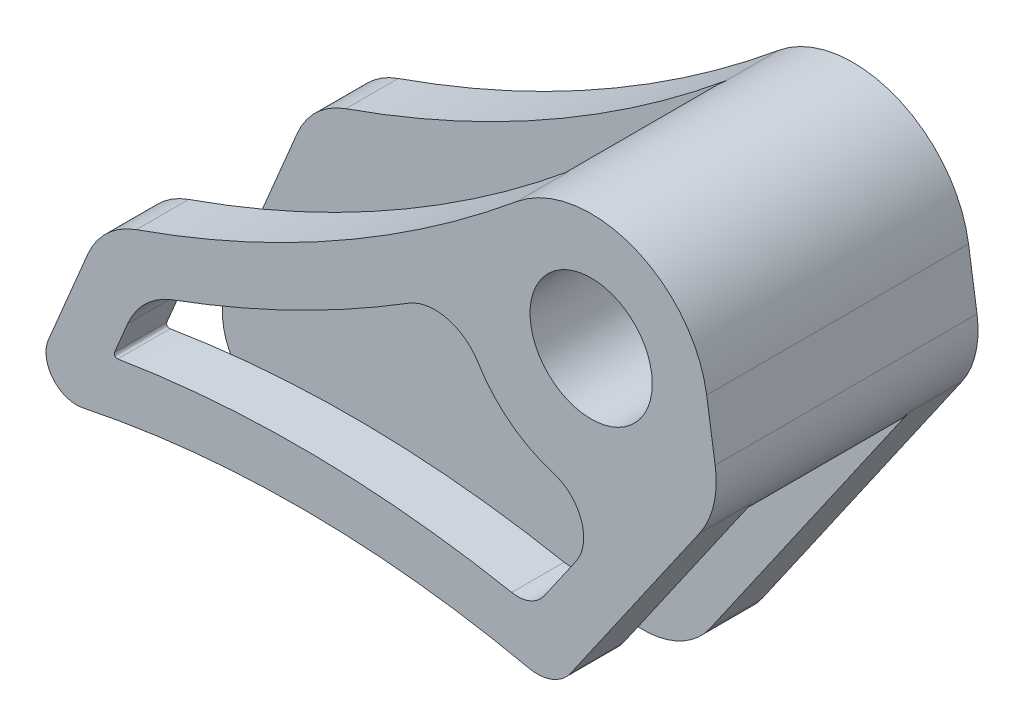
ISO-10303-21;
HEADER;
FILE_DESCRIPTION(('STEP AP214'),'2;1');
FILE_NAME('part.step','',(''),(''),'','','');
FILE_SCHEMA(('AUTOMOTIVE_DESIGN { 1 0 10303 214 1 1 1 1 }'));
ENDSEC;
DATA;
#1=APPLICATION_CONTEXT('core data for automotive mechanical design processes');
#2=APPLICATION_PROTOCOL_DEFINITION('international standard','automotive_design',2000,#1);
#3=PRODUCT_CONTEXT('',#1,'mechanical');
#4=PRODUCT('Part','Part','',(#3));
#5=PRODUCT_RELATED_PRODUCT_CATEGORY('part','',(#4));
#6=PRODUCT_DEFINITION_FORMATION('','',#4);
#7=PRODUCT_DEFINITION_CONTEXT('part definition',#1,'design');
#8=PRODUCT_DEFINITION('design','',#6,#7);
#9=PRODUCT_DEFINITION_SHAPE('','',#8);
#10=(LENGTH_UNIT() NAMED_UNIT(*) SI_UNIT(.MILLI.,.METRE.));
#11=(NAMED_UNIT(*) PLANE_ANGLE_UNIT() SI_UNIT($,.RADIAN.));
#12=(NAMED_UNIT(*) SI_UNIT($,.STERADIAN.) SOLID_ANGLE_UNIT());
#13=UNCERTAINTY_MEASURE_WITH_UNIT(LENGTH_MEASURE(1.E-05),#10,'distance_accuracy_value','');
#14=(GEOMETRIC_REPRESENTATION_CONTEXT(3) GLOBAL_UNCERTAINTY_ASSIGNED_CONTEXT((#13)) GLOBAL_UNIT_ASSIGNED_CONTEXT((#10,
#11,#12)) REPRESENTATION_CONTEXT('',''));
#15=CARTESIAN_POINT('',(0.,0.,0.));
#16=DIRECTION('',(0.,0.,1.));
#17=DIRECTION('',(1.,0.,0.));
#18=AXIS2_PLACEMENT_3D('',#15,#16,#17);
#19=CARTESIAN_POINT('',(-12.5649946800251,56.468477358393,15.));
#20=DIRECTION('',(0.,0.,-1.));
#21=DIRECTION('',(-1.,0.,0.));
#22=AXIS2_PLACEMENT_3D('',#19,#20,#21);
#23=CYLINDRICAL_SURFACE('',#22,3.90008535636228);
#24=CARTESIAN_POINT('',(-12.5649946800251,56.468477358393,3.));
#25=DIRECTION('',(0.,0.,1.));
#26=DIRECTION('',(1.,0.,0.));
#27=AXIS2_PLACEMENT_3D('',#24,#25,#26);
#28=CIRCLE('',#27,3.90008535636228);
#29=CARTESIAN_POINT('',(-16.1614135363366,57.977264022199,3.));
#30=VERTEX_POINT('',#29);
#31=CARTESIAN_POINT('',(-11.865953559232,52.6315505545105,3.));
#32=VERTEX_POINT('',#31);
#33=EDGE_CURVE('E350',#30,#32,#28,.T.);
#34=ORIENTED_EDGE('',*,*,#33,.F.);
#35=DIRECTION('',(0.,0.,-1.));
#36=VECTOR('',#35,1.);
#37=CARTESIAN_POINT('',(-16.1614135363366,57.977264022199,15.));
#38=LINE('',#37,#36);
#39=CARTESIAN_POINT('',(-16.1614135363366,57.977264022199,0.));
#40=VERTEX_POINT('',#39);
#41=EDGE_CURVE('E385',#30,#40,#38,.T.);
#42=ORIENTED_EDGE('',*,*,#41,.T.);
#43=CARTESIAN_POINT('',(-12.5649946800251,56.468477358393,0.));
#44=DIRECTION('',(0.,0.,1.));
#45=DIRECTION('',(1.,0.,0.));
#46=AXIS2_PLACEMENT_3D('',#43,#44,#45);
#47=CIRCLE('',#46,3.90008535636228);
#48=CARTESIAN_POINT('',(-11.865953559232,52.6315505545106,0.));
#49=VERTEX_POINT('',#48);
#50=EDGE_CURVE('E368',#40,#49,#47,.T.);
#51=ORIENTED_EDGE('',*,*,#50,.T.);
#52=DIRECTION('',(0.,0.,-1.));
#53=VECTOR('',#52,1.);
#54=CARTESIAN_POINT('',(-11.865953559232,52.6315505545106,15.));
#55=LINE('',#54,#53);
#56=EDGE_CURVE('E439',#32,#49,#55,.T.);
#57=ORIENTED_EDGE('',*,*,#56,.F.);
#58=EDGE_LOOP('',(#34,#42,#51,#57));
#59=FACE_BOUND('',#58,.T.);
#60=ADVANCED_FACE('F37',(#59),#23,.T.);
#61=CARTESIAN_POINT('',(-1.96419316827227,-1.71765540720911,15.));
#62=DIRECTION('',(0.,0.,-1.));
#63=DIRECTION('',(-1.,0.,0.));
#64=AXIS2_PLACEMENT_3D('',#61,#62,#63);
#65=CYLINDRICAL_SURFACE('',#64,55.2438326649175);
#66=CARTESIAN_POINT('',(-1.96419316827227,-1.71765540720911,3.));
#67=DIRECTION('',(0.,0.,1.));
#68=DIRECTION('',(1.,0.,0.));
#69=AXIS2_PLACEMENT_3D('',#66,#67,#68);
#70=CIRCLE('',#69,55.2438326649175);
#71=CARTESIAN_POINT('',(6.9008090395985,52.8102528908711,3.));
#72=VERTEX_POINT('',#71);
#73=EDGE_CURVE('E352',#32,#72,#70,.F.);
#74=ORIENTED_EDGE('',*,*,#73,.F.);
#75=ORIENTED_EDGE('',*,*,#56,.T.);
#76=CARTESIAN_POINT('',(-1.96419316827227,-1.71765540720911,0.));
#77=DIRECTION('',(0.,0.,-1.));
#78=DIRECTION('',(-1.,0.,0.));
#79=AXIS2_PLACEMENT_3D('',#76,#77,#78);
#80=CIRCLE('',#79,55.2438326649175);
#81=CARTESIAN_POINT('',(6.9008090395985,52.8102528908711,0.));
#82=VERTEX_POINT('',#81);
#83=EDGE_CURVE('E388',#49,#82,#80,.T.);
#84=ORIENTED_EDGE('',*,*,#83,.T.);
#85=DIRECTION('',(0.,0.,-1.));
#86=VECTOR('',#85,1.);
#87=CARTESIAN_POINT('',(6.9008090395985,52.8102528908711,15.));
#88=LINE('',#87,#86);
#89=EDGE_CURVE('E437',#72,#82,#88,.T.);
#90=ORIENTED_EDGE('',*,*,#89,.F.);
#91=EDGE_LOOP('',(#74,#75,#84,#90));
#92=FACE_BOUND('',#91,.T.);
#93=ADVANCED_FACE('F510',(#92),#65,.F.);
#94=CARTESIAN_POINT('',(7.64846138166184,57.4090017000569,15.));
#95=DIRECTION('',(0.,0.,-1.));
#96=DIRECTION('',(-1.,0.,0.));
#97=AXIS2_PLACEMENT_3D('',#94,#95,#96);
#98=CYLINDRICAL_SURFACE('',#97,4.65912809810806);
#99=CARTESIAN_POINT('',(7.64846138166184,57.4090017000569,3.));
#100=DIRECTION('',(0.,0.,1.));
#101=DIRECTION('',(1.,0.,0.));
#102=AXIS2_PLACEMENT_3D('',#99,#100,#101);
#103=CIRCLE('',#102,4.65912809810806);
#104=CARTESIAN_POINT('',(11.4756081363501,54.7518561728682,3.));
#105=VERTEX_POINT('',#104);
#106=EDGE_CURVE('E354',#72,#105,#103,.T.);
#107=ORIENTED_EDGE('',*,*,#106,.F.);
#108=ORIENTED_EDGE('',*,*,#89,.T.);
#109=CARTESIAN_POINT('',(7.64846138166184,57.4090017000569,0.));
#110=DIRECTION('',(0.,0.,1.));
#111=DIRECTION('',(1.,0.,0.));
#112=AXIS2_PLACEMENT_3D('',#109,#110,#111);
#113=CIRCLE('',#112,4.65912809810806);
#114=CARTESIAN_POINT('',(11.4756081363501,54.7518561728682,0.));
#115=VERTEX_POINT('',#114);
#116=EDGE_CURVE('E391',#82,#115,#113,.T.);
#117=ORIENTED_EDGE('',*,*,#116,.T.);
#118=DIRECTION('',(0.,0.,-1.));
#119=VECTOR('',#118,1.);
#120=CARTESIAN_POINT('',(11.4756081363501,54.7518561728682,15.));
#121=LINE('',#120,#119);
#122=EDGE_CURVE('E435',#105,#115,#121,.T.);
#123=ORIENTED_EDGE('',*,*,#122,.F.);
#124=EDGE_LOOP('',(#107,#108,#117,#123));
#125=FACE_BOUND('',#124,.T.);
#126=ADVANCED_FACE('F515',(#125),#98,.T.);
#127=CARTESIAN_POINT('',(11.4756081363501,54.7518561728682,15.));
#128=DIRECTION('',(-0.821429819936129,0.570309609703097,0.));
#129=DIRECTION('',(-0.570309609703097,-0.821429819936129,0.));
#130=AXIS2_PLACEMENT_3D('',#127,#128,#129);
#131=PLANE('',#130);
#132=DIRECTION('',(0.570309609703097,0.821429819936129,0.));
#133=VECTOR('',#132,1.);
#134=CARTESIAN_POINT('',(11.4756081363501,54.7518561728682,3.));
#135=LINE('',#134,#133);
#136=CARTESIAN_POINT('',(22.8727833003812,71.1674651394511,3.));
#137=VERTEX_POINT('',#136);
#138=EDGE_CURVE('E356',#105,#137,#135,.T.);
#139=ORIENTED_EDGE('',*,*,#138,.F.);
#140=ORIENTED_EDGE('',*,*,#122,.T.);
#141=DIRECTION('',(0.570309609703097,0.821429819936129,0.));
#142=VECTOR('',#141,1.);
#143=CARTESIAN_POINT('',(11.4756081363501,54.7518561728682,0.));
#144=LINE('',#143,#142);
#145=CARTESIAN_POINT('',(22.8727833003812,71.1674651394511,0.));
#146=VERTEX_POINT('',#145);
#147=EDGE_CURVE('E394',#115,#146,#144,.T.);
#148=ORIENTED_EDGE('',*,*,#147,.T.);
#149=DIRECTION('',(0.,0.,-1.));
#150=VECTOR('',#149,1.);
#151=CARTESIAN_POINT('',(22.8727833003812,71.1674651394511,15.));
#152=LINE('',#151,#150);
#153=EDGE_CURVE('E431',#137,#146,#152,.T.);
#154=ORIENTED_EDGE('',*,*,#153,.F.);
#155=EDGE_LOOP('',(#139,#140,#148,#154));
#156=FACE_BOUND('',#155,.T.);
#157=ADVANCED_FACE('F538',(#156),#131,.F.);
#158=CARTESIAN_POINT('',(-32.732062632373,136.926555555796,15.));
#159=DIRECTION('',(0.,0.,-1.));
#160=DIRECTION('',(-1.,0.,0.));
#161=AXIS2_PLACEMENT_3D('',#158,#159,#160);
#162=CYLINDRICAL_SURFACE('',#161,70.7969539290095);
#163=CARTESIAN_POINT('',(-32.732062632373,136.926555555796,3.));
#164=DIRECTION('',(0.,0.,1.));
#165=DIRECTION('',(1.,0.,0.));
#166=AXIS2_PLACEMENT_3D('',#163,#164,#165);
#167=CIRCLE('',#166,70.7969539290095);
#168=CARTESIAN_POINT('',(12.3922838089483,82.3738100348788,3.));
#169=VERTEX_POINT('',#168);
#170=CARTESIAN_POINT('',(-9.39302807107906,70.0872097228732,3.));
#171=VERTEX_POINT('',#170);
#172=EDGE_CURVE('E348',#169,#171,#167,.F.);
#173=ORIENTED_EDGE('',*,*,#172,.F.);
#174=DIRECTION('',(0.,0.,-1.));
#175=VECTOR('',#174,1.);
#176=CARTESIAN_POINT('',(12.3922838089482,82.3738100348788,15.));
#177=LINE('',#176,#175);
#178=CARTESIAN_POINT('',(12.3922838089482,82.3738100348788,0.));
#179=VERTEX_POINT('',#178);
#180=EDGE_CURVE('E421',#169,#179,#177,.T.);
#181=ORIENTED_EDGE('',*,*,#180,.T.);
#182=CARTESIAN_POINT('',(-32.732062632373,136.926555555796,0.));
#183=DIRECTION('',(0.,0.,-1.));
#184=DIRECTION('',(1.,0.,0.));
#185=AXIS2_PLACEMENT_3D('',#182,#183,#184);
#186=CIRCLE('',#185,70.7969539290095);
#187=CARTESIAN_POINT('',(-9.39302807107906,70.0872097228732,0.));
#188=VERTEX_POINT('',#187);
#189=EDGE_CURVE('E404',#179,#188,#186,.T.);
#190=ORIENTED_EDGE('',*,*,#189,.T.);
#191=DIRECTION('',(0.,0.,-1.));
#192=VECTOR('',#191,1.);
#193=CARTESIAN_POINT('',(-9.39302807107906,70.0872097228732,15.));
#194=LINE('',#193,#192);
#195=EDGE_CURVE('E417',#171,#188,#194,.T.);
#196=ORIENTED_EDGE('',*,*,#195,.F.);
#197=EDGE_LOOP('',(#173,#181,#190,#196));
#198=FACE_BOUND('',#197,.T.);
#199=ADVANCED_FACE('F548',(#198),#162,.F.);
#200=CARTESIAN_POINT('',(-7.84171841421055,65.6445014190196,15.));
#201=DIRECTION('',(0.,0.,-1.));
#202=DIRECTION('',(-1.,0.,0.));
#203=AXIS2_PLACEMENT_3D('',#200,#201,#202);
#204=CYLINDRICAL_SURFACE('',#203,4.70576441448391);
#205=CARTESIAN_POINT('',(-7.84171841421055,65.6445014190196,3.));
#206=DIRECTION('',(0.,0.,1.));
#207=DIRECTION('',(1.,0.,0.));
#208=AXIS2_PLACEMENT_3D('',#205,#206,#207);
#209=CIRCLE('',#208,4.70576441448391);
#210=CARTESIAN_POINT('',(-12.1810849478176,67.4649730094692,3.));
#211=VERTEX_POINT('',#210);
#212=EDGE_CURVE('E346',#171,#211,#209,.T.);
#213=ORIENTED_EDGE('',*,*,#212,.F.);
#214=ORIENTED_EDGE('',*,*,#195,.T.);
#215=CARTESIAN_POINT('',(-7.84171841421055,65.6445014190196,0.));
#216=DIRECTION('',(0.,0.,1.));
#217=DIRECTION('',(-1.,0.,0.));
#218=AXIS2_PLACEMENT_3D('',#215,#216,#217);
#219=CIRCLE('',#218,4.70576441448391);
#220=CARTESIAN_POINT('',(-12.1810849478176,67.4649730094692,0.));
#221=VERTEX_POINT('',#220);
#222=EDGE_CURVE('E407',#188,#221,#219,.T.);
#223=ORIENTED_EDGE('',*,*,#222,.T.);
#224=DIRECTION('',(0.,0.,-1.));
#225=VECTOR('',#224,1.);
#226=CARTESIAN_POINT('',(-12.1810849478176,67.4649730094692,15.));
#227=LINE('',#226,#225);
#228=EDGE_CURVE('E413',#211,#221,#227,.T.);
#229=ORIENTED_EDGE('',*,*,#228,.F.);
#230=EDGE_LOOP('',(#213,#214,#223,#229));
#231=FACE_BOUND('',#230,.T.);
#232=ADVANCED_FACE('F552',(#231),#204,.T.);
#233=CARTESIAN_POINT('',(-16.1614135363366,57.977264022199,15.));
#234=DIRECTION('',(0.922138498954792,-0.386859908423454,0.));
#235=DIRECTION('',(0.386859908423454,0.922138498954792,0.));
#236=AXIS2_PLACEMENT_3D('',#233,#234,#235);
#237=PLANE('',#236);
#238=DIRECTION('',(-0.386859908423454,-0.922138498954792,0.));
#239=VECTOR('',#238,1.);
#240=CARTESIAN_POINT('',(-16.1614135363366,57.977264022199,3.));
#241=LINE('',#240,#239);
#242=EDGE_CURVE('E12',#211,#30,#241,.T.);
#243=ORIENTED_EDGE('',*,*,#242,.F.);
#244=ORIENTED_EDGE('',*,*,#228,.T.);
#245=DIRECTION('',(-0.386859908423454,-0.922138498954792,0.));
#246=VECTOR('',#245,1.);
#247=CARTESIAN_POINT('',(-16.1614135363366,57.977264022199,0.));
#248=LINE('',#247,#246);
#249=EDGE_CURVE('E372',#221,#40,#248,.T.);
#250=ORIENTED_EDGE('',*,*,#249,.T.);
#251=ORIENTED_EDGE('',*,*,#41,.F.);
#252=EDGE_LOOP('',(#243,#244,#250,#251));
#253=FACE_BOUND('',#252,.T.);
#254=ADVANCED_FACE('F523',(#253),#237,.F.);
#255=CARTESIAN_POINT('',(16.6570198918994,77.2179888298084,0.));
#256=DIRECTION('',(0.,0.,1.));
#257=DIRECTION('',(1.,0.,0.));
#258=AXIS2_PLACEMENT_3D('',#255,#256,#257);
#259=CYLINDRICAL_SURFACE('',#258,2.1);
#260=CARTESIAN_POINT('',(16.6570198918994,77.2179888298084,0.));
#261=DIRECTION('',(0.,0.,1.));
#262=DIRECTION('',(1.,0.,0.));
#263=AXIS2_PLACEMENT_3D('',#260,#261,#262);
#264=CIRCLE('',#263,2.1);
#265=CARTESIAN_POINT('',(18.7570198918994,77.2179888298084,0.));
#266=VERTEX_POINT('',#265);
#267=EDGE_CURVE('E365',#266,#266,#264,.T.);
#268=ORIENTED_EDGE('',*,*,#267,.F.);
#269=EDGE_LOOP('',(#268));
#270=FACE_BOUND('',#269,.T.);
#271=CARTESIAN_POINT('',(16.6570198918994,77.2179888298084,10.));
#272=DIRECTION('',(0.,0.,1.));
#273=DIRECTION('',(1.,0.,0.));
#274=AXIS2_PLACEMENT_3D('',#271,#272,#273);
#275=CIRCLE('',#274,2.1);
#276=CARTESIAN_POINT('',(18.7570198918994,77.2179888298084,10.));
#277=VERTEX_POINT('',#276);
#278=EDGE_CURVE('E362',#277,#277,#275,.F.);
#279=ORIENTED_EDGE('',*,*,#278,.F.);
#280=EDGE_LOOP('',(#279));
#281=FACE_BOUND('',#280,.T.);
#282=ADVANCED_FACE('F559',(#270,#281),#259,.F.);
#283=DIRECTION('',(0.570309609703097,0.821429819936129,0.));
#284=VECTOR('',#283,1.);
#285=CARTESIAN_POINT('',(11.4756081363501,54.7518561728682,15.));
#286=LINE('',#285,#284);
#287=CARTESIAN_POINT('',(15.4879981080366,60.5309921296896,15.));
#288=VERTEX_POINT('',#287);
#289=CARTESIAN_POINT('',(22.8727833003812,71.1674651394511,15.));
#290=VERTEX_POINT('',#289);
#291=EDGE_CURVE('E369',#288,#290,#286,.T.);
#292=ORIENTED_EDGE('',*,*,#291,.F.);
#293=DIRECTION('',(0.,0.,1.));
#294=VECTOR('',#293,1.);
#295=CARTESIAN_POINT('',(15.4879981080366,60.5309921296896,-26.1922653554615));
#296=LINE('',#295,#294);
#297=CARTESIAN_POINT('',(15.4879981080366,60.5309921296896,12.));
#298=VERTEX_POINT('',#297);
#299=EDGE_CURVE('E315',#298,#288,#296,.T.);
#300=ORIENTED_EDGE('',*,*,#299,.F.);
#301=DIRECTION('',(0.570309609703097,0.821429819936129,0.));
#302=VECTOR('',#301,1.);
#303=CARTESIAN_POINT('',(11.4756081363501,54.7518561728682,12.));
#304=LINE('',#303,#302);
#305=CARTESIAN_POINT('',(22.8727833003812,71.1674651394511,12.));
#306=VERTEX_POINT('',#305);
#307=EDGE_CURVE('E344',#298,#306,#304,.T.);
#308=ORIENTED_EDGE('',*,*,#307,.T.);
#309=EDGE_CURVE('E432',#290,#306,#152,.T.);
#310=ORIENTED_EDGE('',*,*,#309,.F.);
#311=EDGE_LOOP('',(#292,#300,#308,#310));
#312=FACE_BOUND('',#311,.T.);
#313=ADVANCED_FACE('F486',(#312),#131,.F.);
#314=CARTESIAN_POINT('',(18.5184327628496,74.1906424034116,15.));
#315=DIRECTION('',(0.,0.,-1.));
#316=DIRECTION('',(-1.,0.,0.));
#317=AXIS2_PLACEMENT_3D('',#314,#315,#316);
#318=CYLINDRICAL_SURFACE('',#317,5.30094042345594);
#319=CARTESIAN_POINT('',(18.5184327628496,74.1906424034116,0.));
#320=DIRECTION('',(0.,0.,1.));
#321=DIRECTION('',(-1.,0.,0.));
#322=AXIS2_PLACEMENT_3D('',#319,#320,#321);
#323=CIRCLE('',#322,5.30094042345594);
#324=CARTESIAN_POINT('',(23.7603382438377,74.9795633762705,0.));
#325=VERTEX_POINT('',#324);
#326=EDGE_CURVE('E397',#146,#325,#323,.T.);
#327=ORIENTED_EDGE('',*,*,#326,.T.);
#328=DIRECTION('',(0.,0.,-1.));
#329=VECTOR('',#328,1.);
#330=CARTESIAN_POINT('',(23.7603382438377,74.9795633762705,15.));
#331=LINE('',#330,#329);
#332=CARTESIAN_POINT('',(23.7603382438377,74.9795633762705,15.));
#333=VERTEX_POINT('',#332);
#334=EDGE_CURVE('E428',#333,#325,#331,.T.);
#335=ORIENTED_EDGE('',*,*,#334,.F.);
#336=CARTESIAN_POINT('',(18.5184327628496,74.1906424034116,15.));
#337=DIRECTION('',(0.,0.,1.));
#338=DIRECTION('',(-1.,0.,0.));
#339=AXIS2_PLACEMENT_3D('',#336,#337,#338);
#340=CIRCLE('',#339,5.30094042345594);
#341=EDGE_CURVE('E371',#290,#333,#340,.T.);
#342=ORIENTED_EDGE('',*,*,#341,.F.);
#343=ORIENTED_EDGE('',*,*,#309,.T.);
#344=CARTESIAN_POINT('',(18.5184327628496,74.1906424034116,12.));
#345=DIRECTION('',(0.,0.,1.));
#346=DIRECTION('',(1.,0.,0.));
#347=AXIS2_PLACEMENT_3D('',#344,#345,#346);
#348=CIRCLE('',#347,5.30094042345593);
#349=CARTESIAN_POINT('',(15.4486759772898,69.8690035186206,12.));
#350=VERTEX_POINT('',#349);
#351=EDGE_CURVE('E303',#306,#350,#348,.F.);
#352=ORIENTED_EDGE('',*,*,#351,.T.);
#353=DIRECTION('',(0.,0.,1.));
#354=VECTOR('',#353,1.);
#355=CARTESIAN_POINT('',(15.4486759772898,69.8690035186206,-67.9355722689827));
#356=LINE('',#355,#354);
#357=CARTESIAN_POINT('',(15.4486759772898,69.8690035186206,3.));
#358=VERTEX_POINT('',#357);
#359=EDGE_CURVE('E322',#358,#350,#356,.T.);
#360=ORIENTED_EDGE('',*,*,#359,.F.);
#361=CARTESIAN_POINT('',(18.5184327628496,74.1906424034116,3.));
#362=DIRECTION('',(0.,0.,1.));
#363=DIRECTION('',(1.,0.,0.));
#364=AXIS2_PLACEMENT_3D('',#361,#362,#363);
#365=CIRCLE('',#364,5.30094042345593);
#366=EDGE_CURVE('E330',#358,#137,#365,.T.);
#367=ORIENTED_EDGE('',*,*,#366,.T.);
#368=ORIENTED_EDGE('',*,*,#153,.T.);
#369=EDGE_LOOP('',(#327,#335,#342,#343,#352,#360,#367,#368));
#370=FACE_BOUND('',#369,.T.);
#371=ADVANCED_FACE('F477',(#370),#318,.T.);
#372=CARTESIAN_POINT('',(23.2735770813542,78.2137986081063,15.));
#373=DIRECTION('',(-0.988863307686565,-0.148826606193874,0.));
#374=DIRECTION('',(0.148826606193874,-0.988863307686565,0.));
#375=AXIS2_PLACEMENT_3D('',#372,#373,#374);
#376=PLANE('',#375);
#377=DIRECTION('',(-0.148826606193874,0.988863307686565,0.));
#378=VECTOR('',#377,1.);
#379=CARTESIAN_POINT('',(23.2735770813542,78.2137986081063,0.));
#380=LINE('',#379,#378);
#381=CARTESIAN_POINT('',(23.2735770813542,78.2137986081063,0.));
#382=VERTEX_POINT('',#381);
#383=EDGE_CURVE('E399',#325,#382,#380,.T.);
#384=ORIENTED_EDGE('',*,*,#383,.T.);
#385=DIRECTION('',(0.,0.,-1.));
#386=VECTOR('',#385,1.);
#387=CARTESIAN_POINT('',(23.2735770813542,78.2137986081063,15.));
#388=LINE('',#387,#386);
#389=CARTESIAN_POINT('',(23.2735770813542,78.2137986081063,15.));
#390=VERTEX_POINT('',#389);
#391=EDGE_CURVE('E425',#390,#382,#388,.T.);
#392=ORIENTED_EDGE('',*,*,#391,.F.);
#393=DIRECTION('',(-0.148826606193874,0.988863307686565,0.));
#394=VECTOR('',#393,1.);
#395=CARTESIAN_POINT('',(23.2735770813542,78.2137986081063,15.));
#396=LINE('',#395,#394);
#397=EDGE_CURVE('E374',#333,#390,#396,.T.);
#398=ORIENTED_EDGE('',*,*,#397,.F.);
#399=ORIENTED_EDGE('',*,*,#334,.T.);
#400=EDGE_LOOP('',(#384,#392,#398,#399));
#401=FACE_BOUND('',#400,.T.);
#402=ADVANCED_FACE('F543',(#401),#376,.F.);
#403=CARTESIAN_POINT('',(16.6570198918994,77.2179888298084,15.));
#404=DIRECTION('',(0.,0.,-1.));
#405=DIRECTION('',(-1.,0.,0.));
#406=AXIS2_PLACEMENT_3D('',#403,#404,#405);
#407=CYLINDRICAL_SURFACE('',#406,6.69107361758031);
#408=ORIENTED_EDGE('',*,*,#180,.F.);
#409=CARTESIAN_POINT('',(16.6570198918995,77.2179888298084,3.));
#410=DIRECTION('',(0.,0.,1.));
#411=DIRECTION('',(1.,0.,0.));
#412=AXIS2_PLACEMENT_3D('',#409,#410,#411);
#413=CIRCLE('',#412,6.69107361758034);
#414=CARTESIAN_POINT('',(12.7822416451262,71.7630314794515,3.));
#415=VERTEX_POINT('',#414);
#416=EDGE_CURVE('E328',#169,#415,#413,.T.);
#417=ORIENTED_EDGE('',*,*,#416,.T.);
#418=DIRECTION('',(0.,0.,1.));
#419=VECTOR('',#418,1.);
#420=CARTESIAN_POINT('',(12.7822416451262,71.7630314794515,-67.9355722689827));
#421=LINE('',#420,#419);
#422=CARTESIAN_POINT('',(12.7822416451262,71.7630314794515,12.));
#423=VERTEX_POINT('',#422);
#424=EDGE_CURVE('E331',#415,#423,#421,.T.);
#425=ORIENTED_EDGE('',*,*,#424,.T.);
#426=CARTESIAN_POINT('',(16.6570198918995,77.2179888298084,12.));
#427=DIRECTION('',(0.,0.,1.));
#428=DIRECTION('',(1.,0.,0.));
#429=AXIS2_PLACEMENT_3D('',#426,#427,#428);
#430=CIRCLE('',#429,6.69107361758034);
#431=CARTESIAN_POINT('',(12.3922838089483,82.3738100348788,12.));
#432=VERTEX_POINT('',#431);
#433=EDGE_CURVE('E319',#423,#432,#430,.F.);
#434=ORIENTED_EDGE('',*,*,#433,.T.);
#435=CARTESIAN_POINT('',(12.3922838089482,82.3738100348788,15.));
#436=VERTEX_POINT('',#435);
#437=EDGE_CURVE('E422',#436,#432,#177,.T.);
#438=ORIENTED_EDGE('',*,*,#437,.F.);
#439=CARTESIAN_POINT('',(16.6570198918994,77.2179888298084,15.));
#440=DIRECTION('',(0.,0.,1.));
#441=DIRECTION('',(-1.,0.,0.));
#442=AXIS2_PLACEMENT_3D('',#439,#440,#441);
#443=CIRCLE('',#442,6.69107361758031);
#444=EDGE_CURVE('E376',#390,#436,#443,.T.);
#445=ORIENTED_EDGE('',*,*,#444,.F.);
#446=ORIENTED_EDGE('',*,*,#391,.T.);
#447=CARTESIAN_POINT('',(16.6570198918994,77.2179888298084,0.));
#448=DIRECTION('',(0.,0.,1.));
#449=DIRECTION('',(-1.,0.,0.));
#450=AXIS2_PLACEMENT_3D('',#447,#448,#449);
#451=CIRCLE('',#450,6.69107361758031);
#452=EDGE_CURVE('E401',#382,#179,#451,.T.);
#453=ORIENTED_EDGE('',*,*,#452,.T.);
#454=EDGE_LOOP('',(#408,#417,#425,#434,#438,#445,#446,#453));
#455=FACE_BOUND('',#454,.T.);
#456=ADVANCED_FACE('F463',(#455),#407,.T.);
#457=ORIENTED_EDGE('',*,*,#437,.T.);
#458=CARTESIAN_POINT('',(-32.732062632373,136.926555555796,12.));
#459=DIRECTION('',(0.,0.,1.));
#460=DIRECTION('',(1.,0.,0.));
#461=AXIS2_PLACEMENT_3D('',#458,#459,#460);
#462=CIRCLE('',#461,70.7969539290095);
#463=CARTESIAN_POINT('',(-9.39302807107906,70.0872097228732,12.));
#464=VERTEX_POINT('',#463);
#465=EDGE_CURVE('E341',#432,#464,#462,.F.);
#466=ORIENTED_EDGE('',*,*,#465,.T.);
#467=CARTESIAN_POINT('',(-9.39302807107906,70.0872097228732,15.));
#468=VERTEX_POINT('',#467);
#469=EDGE_CURVE('E418',#468,#464,#194,.T.);
#470=ORIENTED_EDGE('',*,*,#469,.F.);
#471=CARTESIAN_POINT('',(-32.732062632373,136.926555555796,15.));
#472=DIRECTION('',(0.,0.,-1.));
#473=DIRECTION('',(1.,0.,0.));
#474=AXIS2_PLACEMENT_3D('',#471,#472,#473);
#475=CIRCLE('',#474,70.7969539290095);
#476=EDGE_CURVE('E378',#436,#468,#475,.T.);
#477=ORIENTED_EDGE('',*,*,#476,.F.);
#478=EDGE_LOOP('',(#457,#466,#470,#477));
#479=FACE_BOUND('',#478,.T.);
#480=ADVANCED_FACE('F457',(#479),#162,.F.);
#481=ORIENTED_EDGE('',*,*,#469,.T.);
#482=CARTESIAN_POINT('',(-7.84171841421055,65.6445014190196,12.));
#483=DIRECTION('',(0.,0.,1.));
#484=DIRECTION('',(1.,0.,0.));
#485=AXIS2_PLACEMENT_3D('',#482,#483,#484);
#486=CIRCLE('',#485,4.70576441448391);
#487=CARTESIAN_POINT('',(-12.1810849478176,67.4649730094692,12.));
#488=VERTEX_POINT('',#487);
#489=EDGE_CURVE('E338',#464,#488,#486,.T.);
#490=ORIENTED_EDGE('',*,*,#489,.T.);
#491=CARTESIAN_POINT('',(-12.1810849478176,67.4649730094692,15.));
#492=VERTEX_POINT('',#491);
#493=EDGE_CURVE('E414',#492,#488,#227,.T.);
#494=ORIENTED_EDGE('',*,*,#493,.F.);
#495=CARTESIAN_POINT('',(-7.84171841421055,65.6445014190196,15.));
#496=DIRECTION('',(0.,0.,1.));
#497=DIRECTION('',(-1.,0.,0.));
#498=AXIS2_PLACEMENT_3D('',#495,#496,#497);
#499=CIRCLE('',#498,4.70576441448391);
#500=EDGE_CURVE('E380',#468,#492,#499,.T.);
#501=ORIENTED_EDGE('',*,*,#500,.F.);
#502=EDGE_LOOP('',(#481,#490,#494,#501));
#503=FACE_BOUND('',#502,.T.);
#504=ADVANCED_FACE('F452',(#503),#204,.T.);
#505=DIRECTION('',(-0.386859908423454,-0.922138498954792,0.));
#506=VECTOR('',#505,1.);
#507=CARTESIAN_POINT('',(-16.1614135363366,57.977264022199,12.));
#508=LINE('',#507,#506);
#509=CARTESIAN_POINT('',(-14.4319822149092,62.099622447205,12.));
#510=VERTEX_POINT('',#509);
#511=EDGE_CURVE('E44',#488,#510,#508,.T.);
#512=ORIENTED_EDGE('',*,*,#511,.T.);
#513=DIRECTION('',(0.,0.,1.));
#514=VECTOR('',#513,1.);
#515=CARTESIAN_POINT('',(-14.4319822149092,62.099622447205,-26.1922653554615));
#516=LINE('',#515,#514);
#517=CARTESIAN_POINT('',(-14.4319822149092,62.099622447205,15.));
#518=VERTEX_POINT('',#517);
#519=EDGE_CURVE('E311',#510,#518,#516,.T.);
#520=ORIENTED_EDGE('',*,*,#519,.T.);
#521=DIRECTION('',(-0.386859908423454,-0.922138498954792,0.));
#522=VECTOR('',#521,1.);
#523=CARTESIAN_POINT('',(-16.1614135363366,57.977264022199,15.));
#524=LINE('',#523,#522);
#525=EDGE_CURVE('E382',#492,#518,#524,.T.);
#526=ORIENTED_EDGE('',*,*,#525,.F.);
#527=ORIENTED_EDGE('',*,*,#493,.T.);
#528=EDGE_LOOP('',(#512,#520,#526,#527));
#529=FACE_BOUND('',#528,.T.);
#530=ADVANCED_FACE('F444',(#529),#237,.F.);
#531=CARTESIAN_POINT('',(-12.5649946800251,56.468477358393,15.));
#532=DIRECTION('',(0.,0.,1.));
#533=DIRECTION('',(1.,0.,0.));
#534=AXIS2_PLACEMENT_3D('',#531,#532,#533);
#535=PLANE('',#534);
#536=CARTESIAN_POINT('',(-5.77772458980726,63.4673635058811,15.));
#537=DIRECTION('',(0.,0.,1.));
#538=DIRECTION('',(-1.,0.,0.));
#539=AXIS2_PLACEMENT_3D('',#536,#537,#538);
#540=CIRCLE('',#539,4.45129995527311);
#541=CARTESIAN_POINT('',(-7.3110731026153,67.6462286185742,15.));
#542=VERTEX_POINT('',#541);
#543=CARTESIAN_POINT('',(-9.88243964896035,65.1893929989433,15.));
#544=VERTEX_POINT('',#543);
#545=EDGE_CURVE('E51',#542,#544,#540,.T.);
#546=ORIENTED_EDGE('',*,*,#545,.F.);
#547=CARTESIAN_POINT('',(-32.732062632373,136.926555555796,15.));
#548=DIRECTION('',(0.,0.,-1.));
#549=DIRECTION('',(1.,0.,0.));
#550=AXIS2_PLACEMENT_3D('',#547,#548,#549);
#551=CIRCLE('',#550,73.7969539290095);
#552=CARTESIAN_POINT('',(6.19725288568987,74.2328652632674,15.));
#553=VERTEX_POINT('',#552);
#554=EDGE_CURVE('E272',#553,#542,#551,.T.);
#555=ORIENTED_EDGE('',*,*,#554,.F.);
#556=CARTESIAN_POINT('',(7.71765353324868,71.7843370512986,15.));
#557=DIRECTION('',(0.,0.,1.));
#558=DIRECTION('',(-1.,0.,0.));
#559=AXIS2_PLACEMENT_3D('',#556,#557,#558);
#560=CIRCLE('',#559,2.88217080234749);
#561=CARTESIAN_POINT('',(10.1805415930424,73.281364418727,15.));
#562=VERTEX_POINT('',#561);
#563=EDGE_CURVE('E269',#562,#553,#560,.T.);
#564=ORIENTED_EDGE('',*,*,#563,.F.);
#565=CARTESIAN_POINT('',(16.6570198918994,77.2179888298084,15.));
#566=DIRECTION('',(0.,0.,-1.));
#567=DIRECTION('',(1.,0.,0.));
#568=AXIS2_PLACEMENT_3D('',#565,#566,#567);
#569=CIRCLE('',#568,7.57903575064056);
#570=CARTESIAN_POINT('',(14.489067204096,69.9556363147529,15.));
#571=VERTEX_POINT('',#570);
#572=EDGE_CURVE('E266',#571,#562,#569,.T.);
#573=ORIENTED_EDGE('',*,*,#572,.F.);
#574=CARTESIAN_POINT('',(13.792112851149,67.6209321367147,15.));
#575=DIRECTION('',(0.,0.,1.));
#576=DIRECTION('',(-1.,0.,0.));
#577=AXIS2_PLACEMENT_3D('',#574,#575,#576);
#578=CIRCLE('',#577,2.43651163942236);
#579=CARTESIAN_POINT('',(15.793536168392,66.2313661345987,15.));
#580=VERTEX_POINT('',#579);
#581=EDGE_CURVE('E263',#580,#571,#578,.T.);
#582=ORIENTED_EDGE('',*,*,#581,.F.);
#583=DIRECTION('',(0.570309609703095,0.82142981993613,0.));
#584=VECTOR('',#583,1.);
#585=CARTESIAN_POINT('',(13.9663150402211,63.5995782482289,15.));
#586=LINE('',#585,#584);
#587=CARTESIAN_POINT('',(13.9663150402211,63.5995782482289,15.));
#588=VERTEX_POINT('',#587);
#589=EDGE_CURVE('E260',#588,#580,#586,.T.);
#590=ORIENTED_EDGE('',*,*,#589,.F.);
#591=CARTESIAN_POINT('',(12.4579748542203,64.6468021033898,15.));
#592=DIRECTION('',(0.,0.,1.));
#593=DIRECTION('',(1.,0.,0.));
#594=AXIS2_PLACEMENT_3D('',#591,#592,#593);
#595=CIRCLE('',#594,1.83623743549766);
#596=CARTESIAN_POINT('',(12.1105096786744,62.8437391895385,15.));
#597=VERTEX_POINT('',#596);
#598=EDGE_CURVE('E254',#597,#588,#595,.T.);
#599=ORIENTED_EDGE('',*,*,#598,.F.);
#600=CARTESIAN_POINT('',(0.,0.,15.));
#601=DIRECTION('',(0.,0.,-1.));
#602=DIRECTION('',(-1.,0.,0.));
#603=AXIS2_PLACEMENT_3D('',#600,#601,#602);
#604=CIRCLE('',#603,64.);
#605=CARTESIAN_POINT('',(-10.4585456039366,63.1396770965007,15.));
#606=VERTEX_POINT('',#605);
#607=EDGE_CURVE('E252',#606,#597,#604,.T.);
#608=ORIENTED_EDGE('',*,*,#607,.F.);
#609=CARTESIAN_POINT('',(-10.486454495646,63.3081669111832,15.));
#610=DIRECTION('',(0.,0.,1.));
#611=DIRECTION('',(1.,0.,0.));
#612=AXIS2_PLACEMENT_3D('',#609,#610,#611);
#613=CIRCLE('',#612,0.170785607965586);
#614=CARTESIAN_POINT('',(-10.6439424798185,63.3742370158408,15.));
#615=VERTEX_POINT('',#614);
#616=EDGE_CURVE('E235',#615,#606,#613,.T.);
#617=ORIENTED_EDGE('',*,*,#616,.F.);
#618=DIRECTION('',(-0.386859908423456,-0.922138498954791,0.));
#619=VECTOR('',#618,1.);
#620=CARTESIAN_POINT('',(-9.88243964896035,65.1893929989433,15.));
#621=LINE('',#620,#619);
#622=EDGE_CURVE('E244',#544,#615,#621,.T.);
#623=ORIENTED_EDGE('',*,*,#622,.F.);
#624=EDGE_LOOP('',(#546,#555,#564,#573,#582,#590,#599,#608,#617,#623));
#625=FACE_BOUND('',#624,.T.);
#626=CARTESIAN_POINT('',(-12.8206652842446,61.4236351405861,15.));
#627=DIRECTION('',(0.,0.,-1.));
#628=DIRECTION('',(1.,0.,0.));
#629=AXIS2_PLACEMENT_3D('',#626,#627,#628);
#630=CIRCLE('',#629,1.74736976331743);
#631=CARTESIAN_POINT('',(-12.4636392774526,59.7131283384277,15.));
#632=VERTEX_POINT('',#631);
#633=EDGE_CURVE('E293',#632,#518,#630,.T.);
#634=ORIENTED_EDGE('',*,*,#633,.F.);
#635=CARTESIAN_POINT('',(0.,0.,15.));
#636=DIRECTION('',(0.,0.,1.));
#637=DIRECTION('',(-1.,0.,0.));
#638=AXIS2_PLACEMENT_3D('',#635,#636,#637);
#639=CIRCLE('',#638,61.);
#640=CARTESIAN_POINT('',(13.0720756106862,59.5828904907147,15.));
#641=VERTEX_POINT('',#640);
#642=EDGE_CURVE('E308',#641,#632,#639,.T.);
#643=ORIENTED_EDGE('',*,*,#642,.F.);
#644=CARTESIAN_POINT('',(13.5719406652342,61.8612895523694,15.));
#645=DIRECTION('',(0.,0.,-1.));
#646=DIRECTION('',(1.,0.,0.));
#647=AXIS2_PLACEMENT_3D('',#644,#645,#646);
#648=CIRCLE('',#647,2.332588124146);
#649=EDGE_CURVE('E305',#288,#641,#648,.T.);
#650=ORIENTED_EDGE('',*,*,#649,.F.);
#651=ORIENTED_EDGE('',*,*,#291,.T.);
#652=ORIENTED_EDGE('',*,*,#341,.T.);
#653=ORIENTED_EDGE('',*,*,#397,.T.);
#654=ORIENTED_EDGE('',*,*,#444,.T.);
#655=ORIENTED_EDGE('',*,*,#476,.T.);
#656=ORIENTED_EDGE('',*,*,#500,.T.);
#657=ORIENTED_EDGE('',*,*,#525,.T.);
#658=EDGE_LOOP('',(#634,#643,#650,#651,#652,#653,#654,#655,#656,#657));
#659=FACE_BOUND('',#658,.T.);
#660=CARTESIAN_POINT('',(16.6570198918994,77.2179888298084,15.));
#661=DIRECTION('',(0.,0.,1.));
#662=DIRECTION('',(1.,0.,0.));
#663=AXIS2_PLACEMENT_3D('',#660,#661,#662);
#664=CIRCLE('',#663,3.5);
#665=CARTESIAN_POINT('',(20.1570198918994,77.2179888298084,15.));
#666=VERTEX_POINT('',#665);
#667=EDGE_CURVE('E358',#666,#666,#664,.T.);
#668=ORIENTED_EDGE('',*,*,#667,.F.);
#669=EDGE_LOOP('',(#668));
#670=FACE_BOUND('',#669,.T.);
#671=ADVANCED_FACE('F248',(#625,#659,#670),#535,.T.);
#672=CARTESIAN_POINT('',(-12.5649946800251,56.468477358393,0.));
#673=DIRECTION('',(0.,0.,1.));
#674=DIRECTION('',(1.,0.,0.));
#675=AXIS2_PLACEMENT_3D('',#672,#673,#674);
#676=PLANE('',#675);
#677=ORIENTED_EDGE('',*,*,#267,.T.);
#678=EDGE_LOOP('',(#677));
#679=FACE_BOUND('',#678,.T.);
#680=ORIENTED_EDGE('',*,*,#50,.F.);
#681=ORIENTED_EDGE('',*,*,#249,.F.);
#682=ORIENTED_EDGE('',*,*,#222,.F.);
#683=ORIENTED_EDGE('',*,*,#189,.F.);
#684=ORIENTED_EDGE('',*,*,#452,.F.);
#685=ORIENTED_EDGE('',*,*,#383,.F.);
#686=ORIENTED_EDGE('',*,*,#326,.F.);
#687=ORIENTED_EDGE('',*,*,#147,.F.);
#688=ORIENTED_EDGE('',*,*,#116,.F.);
#689=ORIENTED_EDGE('',*,*,#83,.F.);
#690=EDGE_LOOP('',(#680,#681,#682,#683,#684,#685,#686,#687,#688,#689));
#691=FACE_BOUND('',#690,.T.);
#692=ADVANCED_FACE('F530',(#679,#691),#676,.F.);
#693=CARTESIAN_POINT('',(16.6570198918994,77.2179888298084,10.));
#694=DIRECTION('',(0.,0.,1.));
#695=DIRECTION('',(1.,0.,0.));
#696=AXIS2_PLACEMENT_3D('',#693,#694,#695);
#697=PLANE('',#696);
#698=CARTESIAN_POINT('',(16.6570198918994,77.2179888298084,10.));
#699=DIRECTION('',(0.,0.,1.));
#700=DIRECTION('',(1.,0.,0.));
#701=AXIS2_PLACEMENT_3D('',#698,#699,#700);
#702=CIRCLE('',#701,3.5);
#703=CARTESIAN_POINT('',(20.1570198918994,77.2179888298084,10.));
#704=VERTEX_POINT('',#703);
#705=EDGE_CURVE('E359',#704,#704,#702,.T.);
#706=ORIENTED_EDGE('',*,*,#705,.T.);
#707=EDGE_LOOP('',(#706));
#708=FACE_BOUND('',#707,.T.);
#709=ORIENTED_EDGE('',*,*,#278,.T.);
#710=EDGE_LOOP('',(#709));
#711=FACE_BOUND('',#710,.T.);
#712=ADVANCED_FACE('F822',(#708,#711),#697,.T.);
#713=CARTESIAN_POINT('',(16.6570198918994,77.2179888298084,10.));
#714=DIRECTION('',(0.,0.,1.));
#715=DIRECTION('',(1.,0.,0.));
#716=AXIS2_PLACEMENT_3D('',#713,#714,#715);
#717=CYLINDRICAL_SURFACE('',#716,3.5);
#718=ORIENTED_EDGE('',*,*,#705,.F.);
#719=EDGE_LOOP('',(#718));
#720=FACE_BOUND('',#719,.T.);
#721=ORIENTED_EDGE('',*,*,#667,.T.);
#722=EDGE_LOOP('',(#721));
#723=FACE_BOUND('',#722,.T.);
#724=ADVANCED_FACE('F633',(#720,#723),#717,.F.);
#725=CARTESIAN_POINT('',(-12.5649946800251,56.468477358393,3.));
#726=DIRECTION('',(0.,0.,1.));
#727=DIRECTION('',(1.,0.,0.));
#728=AXIS2_PLACEMENT_3D('',#725,#726,#727);
#729=PLANE('',#728);
#730=ORIENTED_EDGE('',*,*,#138,.T.);
#731=ORIENTED_EDGE('',*,*,#366,.F.);
#732=DIRECTION('',(0.815258904942303,-0.579096639527701,0.));
#733=VECTOR('',#732,1.);
#734=CARTESIAN_POINT('',(15.4486759772898,69.8690035186206,3.));
#735=LINE('',#734,#733);
#736=EDGE_CURVE('E334',#415,#358,#735,.T.);
#737=ORIENTED_EDGE('',*,*,#736,.F.);
#738=ORIENTED_EDGE('',*,*,#416,.F.);
#739=ORIENTED_EDGE('',*,*,#172,.T.);
#740=ORIENTED_EDGE('',*,*,#212,.T.);
#741=ORIENTED_EDGE('',*,*,#242,.T.);
#742=ORIENTED_EDGE('',*,*,#33,.T.);
#743=ORIENTED_EDGE('',*,*,#73,.T.);
#744=ORIENTED_EDGE('',*,*,#106,.T.);
#745=EDGE_LOOP('',(#730,#731,#737,#738,#739,#740,#741,#742,#743,#744));
#746=FACE_BOUND('',#745,.T.);
#747=ADVANCED_FACE('F471',(#746),#729,.T.);
#748=CARTESIAN_POINT('',(-12.5649946800251,56.468477358393,12.));
#749=DIRECTION('',(0.,0.,1.));
#750=DIRECTION('',(1.,0.,0.));
#751=AXIS2_PLACEMENT_3D('',#748,#749,#750);
#752=PLANE('',#751);
#753=CARTESIAN_POINT('',(-32.732062632373,136.926555555796,12.));
#754=DIRECTION('',(0.,0.,1.));
#755=DIRECTION('',(1.,0.,0.));
#756=AXIS2_PLACEMENT_3D('',#753,#754,#755);
#757=CIRCLE('',#756,73.7969539290095);
#758=CARTESIAN_POINT('',(-7.31107310261531,67.6462286185742,12.));
#759=VERTEX_POINT('',#758);
#760=CARTESIAN_POINT('',(6.19725288568987,74.2328652632674,12.));
#761=VERTEX_POINT('',#760);
#762=EDGE_CURVE('E804',#759,#761,#757,.T.);
#763=ORIENTED_EDGE('',*,*,#762,.F.);
#764=CARTESIAN_POINT('',(-5.77772458980726,63.4673635058811,12.));
#765=DIRECTION('',(0.,0.,1.));
#766=DIRECTION('',(1.,0.,0.));
#767=AXIS2_PLACEMENT_3D('',#764,#765,#766);
#768=CIRCLE('',#767,4.45129995527311);
#769=CARTESIAN_POINT('',(-9.88243964896035,65.1893929989433,12.));
#770=VERTEX_POINT('',#769);
#771=EDGE_CURVE('E294',#770,#759,#768,.F.);
#772=ORIENTED_EDGE('',*,*,#771,.F.);
#773=DIRECTION('',(0.386859908423456,0.922138498954791,0.));
#774=VECTOR('',#773,1.);
#775=CARTESIAN_POINT('',(-9.88243964896035,65.1893929989433,12.));
#776=LINE('',#775,#774);
#777=CARTESIAN_POINT('',(-10.6439424798185,63.3742370158408,12.));
#778=VERTEX_POINT('',#777);
#779=EDGE_CURVE('E291',#778,#770,#776,.T.);
#780=ORIENTED_EDGE('',*,*,#779,.F.);
#781=CARTESIAN_POINT('',(-10.486454495646,63.3081669111832,12.));
#782=DIRECTION('',(0.,0.,1.));
#783=DIRECTION('',(1.,0.,0.));
#784=AXIS2_PLACEMENT_3D('',#781,#782,#783);
#785=CIRCLE('',#784,0.170785607965586);
#786=CARTESIAN_POINT('',(-10.4585456039366,63.1396770965007,12.));
#787=VERTEX_POINT('',#786);
#788=EDGE_CURVE('E238',#787,#778,#785,.F.);
#789=ORIENTED_EDGE('',*,*,#788,.F.);
#790=CARTESIAN_POINT('',(0.,0.,12.));
#791=DIRECTION('',(0.,0.,1.));
#792=DIRECTION('',(1.,0.,0.));
#793=AXIS2_PLACEMENT_3D('',#790,#791,#792);
#794=CIRCLE('',#793,64.);
#795=CARTESIAN_POINT('',(12.1105096786744,62.8437391895385,12.));
#796=VERTEX_POINT('',#795);
#797=EDGE_CURVE('E787',#796,#787,#794,.T.);
#798=ORIENTED_EDGE('',*,*,#797,.F.);
#799=CARTESIAN_POINT('',(12.4579748542203,64.6468021033898,12.));
#800=DIRECTION('',(0.,0.,1.));
#801=DIRECTION('',(1.,0.,0.));
#802=AXIS2_PLACEMENT_3D('',#799,#800,#801);
#803=CIRCLE('',#802,1.83623743549766);
#804=CARTESIAN_POINT('',(13.9663150402211,63.5995782482289,12.));
#805=VERTEX_POINT('',#804);
#806=EDGE_CURVE('E789',#805,#796,#803,.F.);
#807=ORIENTED_EDGE('',*,*,#806,.F.);
#808=DIRECTION('',(-0.570309609703096,-0.82142981993613,0.));
#809=VECTOR('',#808,1.);
#810=CARTESIAN_POINT('',(13.9663150402211,63.5995782482289,12.));
#811=LINE('',#810,#809);
#812=CARTESIAN_POINT('',(15.793536168392,66.2313661345987,12.));
#813=VERTEX_POINT('',#812);
#814=EDGE_CURVE('E796',#813,#805,#811,.T.);
#815=ORIENTED_EDGE('',*,*,#814,.F.);
#816=CARTESIAN_POINT('',(13.792112851149,67.6209321367147,12.));
#817=DIRECTION('',(0.,0.,1.));
#818=DIRECTION('',(1.,0.,0.));
#819=AXIS2_PLACEMENT_3D('',#816,#817,#818);
#820=CIRCLE('',#819,2.43651163942236);
#821=CARTESIAN_POINT('',(14.489067204096,69.9556363147529,12.));
#822=VERTEX_POINT('',#821);
#823=EDGE_CURVE('E798',#822,#813,#820,.F.);
#824=ORIENTED_EDGE('',*,*,#823,.F.);
#825=CARTESIAN_POINT('',(16.6570198918994,77.2179888298084,12.));
#826=DIRECTION('',(0.,0.,1.));
#827=DIRECTION('',(1.,0.,0.));
#828=AXIS2_PLACEMENT_3D('',#825,#826,#827);
#829=CIRCLE('',#828,7.57903575064056);
#830=CARTESIAN_POINT('',(10.1805415930424,73.281364418727,12.));
#831=VERTEX_POINT('',#830);
#832=EDGE_CURVE('E800',#831,#822,#829,.T.);
#833=ORIENTED_EDGE('',*,*,#832,.F.);
#834=CARTESIAN_POINT('',(7.71765353324868,71.7843370512986,12.));
#835=DIRECTION('',(0.,0.,1.));
#836=DIRECTION('',(1.,0.,0.));
#837=AXIS2_PLACEMENT_3D('',#834,#835,#836);
#838=CIRCLE('',#837,2.88217080234749);
#839=EDGE_CURVE('E802',#761,#831,#838,.F.);
#840=ORIENTED_EDGE('',*,*,#839,.F.);
#841=EDGE_LOOP('',(#763,#772,#780,#789,#798,#807,#815,#824,#833,#840));
#842=FACE_BOUND('',#841,.T.);
#843=CARTESIAN_POINT('',(0.,0.,12.));
#844=DIRECTION('',(0.,0.,1.));
#845=DIRECTION('',(1.,0.,0.));
#846=AXIS2_PLACEMENT_3D('',#843,#844,#845);
#847=CIRCLE('',#846,61.);
#848=CARTESIAN_POINT('',(-12.4636392774526,59.7131283384278,12.));
#849=VERTEX_POINT('',#848);
#850=CARTESIAN_POINT('',(13.0720756106862,59.5828904907147,12.));
#851=VERTEX_POINT('',#850);
#852=EDGE_CURVE('E297',#849,#851,#847,.F.);
#853=ORIENTED_EDGE('',*,*,#852,.F.);
#854=CARTESIAN_POINT('',(-12.8206652842446,61.4236351405861,12.));
#855=DIRECTION('',(0.,0.,1.));
#856=DIRECTION('',(1.,0.,0.));
#857=AXIS2_PLACEMENT_3D('',#854,#855,#856);
#858=CIRCLE('',#857,1.74736976331743);
#859=EDGE_CURVE('E301',#510,#849,#858,.T.);
#860=ORIENTED_EDGE('',*,*,#859,.F.);
#861=ORIENTED_EDGE('',*,*,#511,.F.);
#862=ORIENTED_EDGE('',*,*,#489,.F.);
#863=ORIENTED_EDGE('',*,*,#465,.F.);
#864=ORIENTED_EDGE('',*,*,#433,.F.);
#865=DIRECTION('',(-0.815258904942303,0.579096639527701,0.));
#866=VECTOR('',#865,1.);
#867=CARTESIAN_POINT('',(15.4486759772898,69.8690035186206,12.));
#868=LINE('',#867,#866);
#869=EDGE_CURVE('E323',#350,#423,#868,.T.);
#870=ORIENTED_EDGE('',*,*,#869,.F.);
#871=ORIENTED_EDGE('',*,*,#351,.F.);
#872=ORIENTED_EDGE('',*,*,#307,.F.);
#873=CARTESIAN_POINT('',(13.5719406652342,61.8612895523694,12.));
#874=DIRECTION('',(0.,0.,1.));
#875=DIRECTION('',(1.,0.,0.));
#876=AXIS2_PLACEMENT_3D('',#873,#874,#875);
#877=CIRCLE('',#876,2.332588124146);
#878=EDGE_CURVE('E295',#851,#298,#877,.T.);
#879=ORIENTED_EDGE('',*,*,#878,.F.);
#880=EDGE_LOOP('',(#853,#860,#861,#862,#863,#864,#870,#871,#872,#879));
#881=FACE_BOUND('',#880,.T.);
#882=ADVANCED_FACE('F450',(#842,#881),#752,.F.);
#883=CARTESIAN_POINT('',(15.4486759772898,69.8690035186206,-67.9355722689827));
#884=DIRECTION('',(0.579096639527701,0.815258904942303,0.));
#885=DIRECTION('',(-0.815258904942303,0.579096639527701,0.));
#886=AXIS2_PLACEMENT_3D('',#883,#884,#885);
#887=PLANE('',#886);
#888=ORIENTED_EDGE('',*,*,#736,.T.);
#889=ORIENTED_EDGE('',*,*,#359,.T.);
#890=ORIENTED_EDGE('',*,*,#869,.T.);
#891=ORIENTED_EDGE('',*,*,#424,.F.);
#892=EDGE_LOOP('',(#888,#889,#890,#891));
#893=FACE_BOUND('',#892,.T.);
#894=ADVANCED_FACE('F468',(#893),#887,.F.);
#895=CARTESIAN_POINT('',(-12.8206652842446,61.4236351405861,-26.1922653554615));
#896=DIRECTION('',(0.,0.,1.));
#897=DIRECTION('',(1.,0.,0.));
#898=AXIS2_PLACEMENT_3D('',#895,#896,#897);
#899=CYLINDRICAL_SURFACE('',#898,1.74736976331743);
#900=ORIENTED_EDGE('',*,*,#859,.T.);
#901=DIRECTION('',(0.,0.,1.));
#902=VECTOR('',#901,1.);
#903=CARTESIAN_POINT('',(-12.4636392774526,59.7131283384277,-26.1922653554615));
#904=LINE('',#903,#902);
#905=EDGE_CURVE('E298',#849,#632,#904,.T.);
#906=ORIENTED_EDGE('',*,*,#905,.T.);
#907=ORIENTED_EDGE('',*,*,#633,.T.);
#908=ORIENTED_EDGE('',*,*,#519,.F.);
#909=EDGE_LOOP('',(#900,#906,#907,#908));
#910=FACE_BOUND('',#909,.T.);
#911=ADVANCED_FACE('F498',(#910),#899,.T.);
#912=CARTESIAN_POINT('',(0.,0.,-26.1922653554615));
#913=DIRECTION('',(0.,0.,1.));
#914=DIRECTION('',(1.,0.,0.));
#915=AXIS2_PLACEMENT_3D('',#912,#913,#914);
#916=CYLINDRICAL_SURFACE('',#915,61.);
#917=ORIENTED_EDGE('',*,*,#852,.T.);
#918=DIRECTION('',(0.,0.,1.));
#919=VECTOR('',#918,1.);
#920=CARTESIAN_POINT('',(13.0720756106862,59.5828904907147,-26.1922653554615));
#921=LINE('',#920,#919);
#922=EDGE_CURVE('E313',#851,#641,#921,.T.);
#923=ORIENTED_EDGE('',*,*,#922,.T.);
#924=ORIENTED_EDGE('',*,*,#642,.T.);
#925=ORIENTED_EDGE('',*,*,#905,.F.);
#926=EDGE_LOOP('',(#917,#923,#924,#925));
#927=FACE_BOUND('',#926,.T.);
#928=ADVANCED_FACE('F496',(#927),#916,.F.);
#929=CARTESIAN_POINT('',(13.5719406652342,61.8612895523694,-26.1922653554615));
#930=DIRECTION('',(0.,0.,1.));
#931=DIRECTION('',(1.,0.,0.));
#932=AXIS2_PLACEMENT_3D('',#929,#930,#931);
#933=CYLINDRICAL_SURFACE('',#932,2.332588124146);
#934=ORIENTED_EDGE('',*,*,#878,.T.);
#935=ORIENTED_EDGE('',*,*,#299,.T.);
#936=ORIENTED_EDGE('',*,*,#649,.T.);
#937=ORIENTED_EDGE('',*,*,#922,.F.);
#938=EDGE_LOOP('',(#934,#935,#936,#937));
#939=FACE_BOUND('',#938,.T.);
#940=ADVANCED_FACE('F490',(#939),#933,.T.);
#941=CARTESIAN_POINT('',(-5.77772458980726,63.4673635058811,-17.3838919103744));
#942=DIRECTION('',(0.,0.,1.));
#943=DIRECTION('',(1.,0.,0.));
#944=AXIS2_PLACEMENT_3D('',#941,#942,#943);
#945=CYLINDRICAL_SURFACE('',#944,4.45129995527311);
#946=ORIENTED_EDGE('',*,*,#771,.T.);
#947=DIRECTION('',(0.,0.,1.));
#948=VECTOR('',#947,1.);
#949=CARTESIAN_POINT('',(-7.3110731026153,67.6462286185742,-17.3838919103744));
#950=LINE('',#949,#948);
#951=EDGE_CURVE('E275',#759,#542,#950,.T.);
#952=ORIENTED_EDGE('',*,*,#951,.T.);
#953=ORIENTED_EDGE('',*,*,#545,.T.);
#954=DIRECTION('',(0.,0.,1.));
#955=VECTOR('',#954,1.);
#956=CARTESIAN_POINT('',(-9.88243964896035,65.1893929989433,-17.3838919103744));
#957=LINE('',#956,#955);
#958=EDGE_CURVE('E241',#770,#544,#957,.T.);
#959=ORIENTED_EDGE('',*,*,#958,.F.);
#960=EDGE_LOOP('',(#946,#952,#953,#959));
#961=FACE_BOUND('',#960,.T.);
#962=ADVANCED_FACE('F674',(#961),#945,.F.);
#963=CARTESIAN_POINT('',(-32.732062632373,136.926555555796,-17.3838919103744));
#964=DIRECTION('',(0.,0.,1.));
#965=DIRECTION('',(1.,0.,0.));
#966=AXIS2_PLACEMENT_3D('',#963,#964,#965);
#967=CYLINDRICAL_SURFACE('',#966,73.7969539290095);
#968=ORIENTED_EDGE('',*,*,#762,.T.);
#969=DIRECTION('',(0.,0.,1.));
#970=VECTOR('',#969,1.);
#971=CARTESIAN_POINT('',(6.19725288568987,74.2328652632674,-17.3838919103744));
#972=LINE('',#971,#970);
#973=EDGE_CURVE('E277',#761,#553,#972,.T.);
#974=ORIENTED_EDGE('',*,*,#973,.T.);
#975=ORIENTED_EDGE('',*,*,#554,.T.);
#976=ORIENTED_EDGE('',*,*,#951,.F.);
#977=EDGE_LOOP('',(#968,#974,#975,#976));
#978=FACE_BOUND('',#977,.T.);
#979=ADVANCED_FACE('F696',(#978),#967,.T.);
#980=CARTESIAN_POINT('',(7.71765353324868,71.7843370512986,-17.3838919103744));
#981=DIRECTION('',(0.,0.,1.));
#982=DIRECTION('',(1.,0.,0.));
#983=AXIS2_PLACEMENT_3D('',#980,#981,#982);
#984=CYLINDRICAL_SURFACE('',#983,2.88217080234749);
#985=ORIENTED_EDGE('',*,*,#839,.T.);
#986=DIRECTION('',(0.,0.,1.));
#987=VECTOR('',#986,1.);
#988=CARTESIAN_POINT('',(10.1805415930424,73.281364418727,-17.3838919103744));
#989=LINE('',#988,#987);
#990=EDGE_CURVE('E279',#831,#562,#989,.T.);
#991=ORIENTED_EDGE('',*,*,#990,.T.);
#992=ORIENTED_EDGE('',*,*,#563,.T.);
#993=ORIENTED_EDGE('',*,*,#973,.F.);
#994=EDGE_LOOP('',(#985,#991,#992,#993));
#995=FACE_BOUND('',#994,.T.);
#996=ADVANCED_FACE('F705',(#995),#984,.F.);
#997=CARTESIAN_POINT('',(16.6570198918994,77.2179888298084,-17.3838919103744));
#998=DIRECTION('',(0.,0.,1.));
#999=DIRECTION('',(1.,0.,0.));
#1000=AXIS2_PLACEMENT_3D('',#997,#998,#999);
#1001=CYLINDRICAL_SURFACE('',#1000,7.57903575064056);
#1002=ORIENTED_EDGE('',*,*,#832,.T.);
#1003=DIRECTION('',(0.,0.,1.));
#1004=VECTOR('',#1003,1.);
#1005=CARTESIAN_POINT('',(14.489067204096,69.9556363147529,-17.3838919103744));
#1006=LINE('',#1005,#1004);
#1007=EDGE_CURVE('E281',#822,#571,#1006,.T.);
#1008=ORIENTED_EDGE('',*,*,#1007,.T.);
#1009=ORIENTED_EDGE('',*,*,#572,.T.);
#1010=ORIENTED_EDGE('',*,*,#990,.F.);
#1011=EDGE_LOOP('',(#1002,#1008,#1009,#1010));
#1012=FACE_BOUND('',#1011,.T.);
#1013=ADVANCED_FACE('F715',(#1012),#1001,.T.);
#1014=CARTESIAN_POINT('',(13.792112851149,67.6209321367147,-17.3838919103744));
#1015=DIRECTION('',(0.,0.,1.));
#1016=DIRECTION('',(1.,0.,0.));
#1017=AXIS2_PLACEMENT_3D('',#1014,#1015,#1016);
#1018=CYLINDRICAL_SURFACE('',#1017,2.43651163942236);
#1019=ORIENTED_EDGE('',*,*,#823,.T.);
#1020=DIRECTION('',(0.,0.,1.));
#1021=VECTOR('',#1020,1.);
#1022=CARTESIAN_POINT('',(15.793536168392,66.2313661345987,-17.3838919103744));
#1023=LINE('',#1022,#1021);
#1024=EDGE_CURVE('E283',#813,#580,#1023,.T.);
#1025=ORIENTED_EDGE('',*,*,#1024,.T.);
#1026=ORIENTED_EDGE('',*,*,#581,.T.);
#1027=ORIENTED_EDGE('',*,*,#1007,.F.);
#1028=EDGE_LOOP('',(#1019,#1025,#1026,#1027));
#1029=FACE_BOUND('',#1028,.T.);
#1030=ADVANCED_FACE('F725',(#1029),#1018,.F.);
#1031=CARTESIAN_POINT('',(13.9663150402211,63.5995782482289,-17.3838919103744));
#1032=DIRECTION('',(0.82142981993613,-0.570309609703095,0.));
#1033=DIRECTION('',(0.570309609703096,0.82142981993613,0.));
#1034=AXIS2_PLACEMENT_3D('',#1031,#1032,#1033);
#1035=PLANE('',#1034);
#1036=ORIENTED_EDGE('',*,*,#814,.T.);
#1037=DIRECTION('',(0.,0.,1.));
#1038=VECTOR('',#1037,1.);
#1039=CARTESIAN_POINT('',(13.9663150402211,63.5995782482289,-17.3838919103744));
#1040=LINE('',#1039,#1038);
#1041=EDGE_CURVE('E285',#805,#588,#1040,.T.);
#1042=ORIENTED_EDGE('',*,*,#1041,.T.);
#1043=ORIENTED_EDGE('',*,*,#589,.T.);
#1044=ORIENTED_EDGE('',*,*,#1024,.F.);
#1045=EDGE_LOOP('',(#1036,#1042,#1043,#1044));
#1046=FACE_BOUND('',#1045,.T.);
#1047=ADVANCED_FACE('F735',(#1046),#1035,.F.);
#1048=CARTESIAN_POINT('',(12.4579748542203,64.6468021033898,-17.3838919103744));
#1049=DIRECTION('',(0.,0.,1.));
#1050=DIRECTION('',(1.,0.,0.));
#1051=AXIS2_PLACEMENT_3D('',#1048,#1049,#1050);
#1052=CYLINDRICAL_SURFACE('',#1051,1.83623743549766);
#1053=ORIENTED_EDGE('',*,*,#806,.T.);
#1054=DIRECTION('',(0.,0.,1.));
#1055=VECTOR('',#1054,1.);
#1056=CARTESIAN_POINT('',(12.1105096786744,62.8437391895385,-17.3838919103744));
#1057=LINE('',#1056,#1055);
#1058=EDGE_CURVE('E287',#796,#597,#1057,.T.);
#1059=ORIENTED_EDGE('',*,*,#1058,.T.);
#1060=ORIENTED_EDGE('',*,*,#598,.T.);
#1061=ORIENTED_EDGE('',*,*,#1041,.F.);
#1062=EDGE_LOOP('',(#1053,#1059,#1060,#1061));
#1063=FACE_BOUND('',#1062,.T.);
#1064=ADVANCED_FACE('F745',(#1063),#1052,.F.);
#1065=CARTESIAN_POINT('',(0.,0.,-17.3838919103744));
#1066=DIRECTION('',(0.,0.,1.));
#1067=DIRECTION('',(1.,0.,0.));
#1068=AXIS2_PLACEMENT_3D('',#1065,#1066,#1067);
#1069=CYLINDRICAL_SURFACE('',#1068,64.);
#1070=ORIENTED_EDGE('',*,*,#797,.T.);
#1071=DIRECTION('',(0.,0.,1.));
#1072=VECTOR('',#1071,1.);
#1073=CARTESIAN_POINT('',(-10.4585456039366,63.1396770965007,-17.3838919103744));
#1074=LINE('',#1073,#1072);
#1075=EDGE_CURVE('E240',#787,#606,#1074,.T.);
#1076=ORIENTED_EDGE('',*,*,#1075,.T.);
#1077=ORIENTED_EDGE('',*,*,#607,.T.);
#1078=ORIENTED_EDGE('',*,*,#1058,.F.);
#1079=EDGE_LOOP('',(#1070,#1076,#1077,#1078));
#1080=FACE_BOUND('',#1079,.T.);
#1081=ADVANCED_FACE('F755',(#1080),#1069,.T.);
#1082=CARTESIAN_POINT('',(-10.486454495646,63.3081669111832,-17.3838919103744));
#1083=DIRECTION('',(0.,0.,1.));
#1084=DIRECTION('',(1.,0.,0.));
#1085=AXIS2_PLACEMENT_3D('',#1082,#1083,#1084);
#1086=CYLINDRICAL_SURFACE('',#1085,0.170785607965586);
#1087=ORIENTED_EDGE('',*,*,#788,.T.);
#1088=DIRECTION('',(0.,0.,1.));
#1089=VECTOR('',#1088,1.);
#1090=CARTESIAN_POINT('',(-10.6439424798185,63.3742370158408,-17.3838919103744));
#1091=LINE('',#1090,#1089);
#1092=EDGE_CURVE('E59',#778,#615,#1091,.T.);
#1093=ORIENTED_EDGE('',*,*,#1092,.T.);
#1094=ORIENTED_EDGE('',*,*,#616,.T.);
#1095=ORIENTED_EDGE('',*,*,#1075,.F.);
#1096=EDGE_LOOP('',(#1087,#1093,#1094,#1095));
#1097=FACE_BOUND('',#1096,.T.);
#1098=ADVANCED_FACE('F232',(#1097),#1086,.F.);
#1099=CARTESIAN_POINT('',(-9.88243964896035,65.1893929989433,-17.3838919103744));
#1100=DIRECTION('',(-0.922138498954791,0.386859908423456,0.));
#1101=DIRECTION('',(-0.386859908423456,-0.922138498954791,0.));
#1102=AXIS2_PLACEMENT_3D('',#1099,#1100,#1101);
#1103=PLANE('',#1102);
#1104=ORIENTED_EDGE('',*,*,#779,.T.);
#1105=ORIENTED_EDGE('',*,*,#958,.T.);
#1106=ORIENTED_EDGE('',*,*,#622,.T.);
#1107=ORIENTED_EDGE('',*,*,#1092,.F.);
#1108=EDGE_LOOP('',(#1104,#1105,#1106,#1107));
#1109=FACE_BOUND('',#1108,.T.);
#1110=ADVANCED_FACE('F245',(#1109),#1103,.F.);
#1111=CLOSED_SHELL('',(#60,#93,#126,#157,#199,#232,#254,#282,#313,#371,#402,#456,#480,#504,#530,
#671,#692,#712,#724,#747,#882,#894,#911,#928,#940,#962,#979,#996,#1013,#1030,#1047,#1064,#1081,
#1098,#1110));
#1112=MANIFOLD_SOLID_BREP('B2',#1111);
#1113=ADVANCED_BREP_SHAPE_REPRESENTATION('',(#18,#1112),#14);
#1114=SHAPE_DEFINITION_REPRESENTATION(#9,#1113);
ENDSEC;
END-ISO-10303-21;
